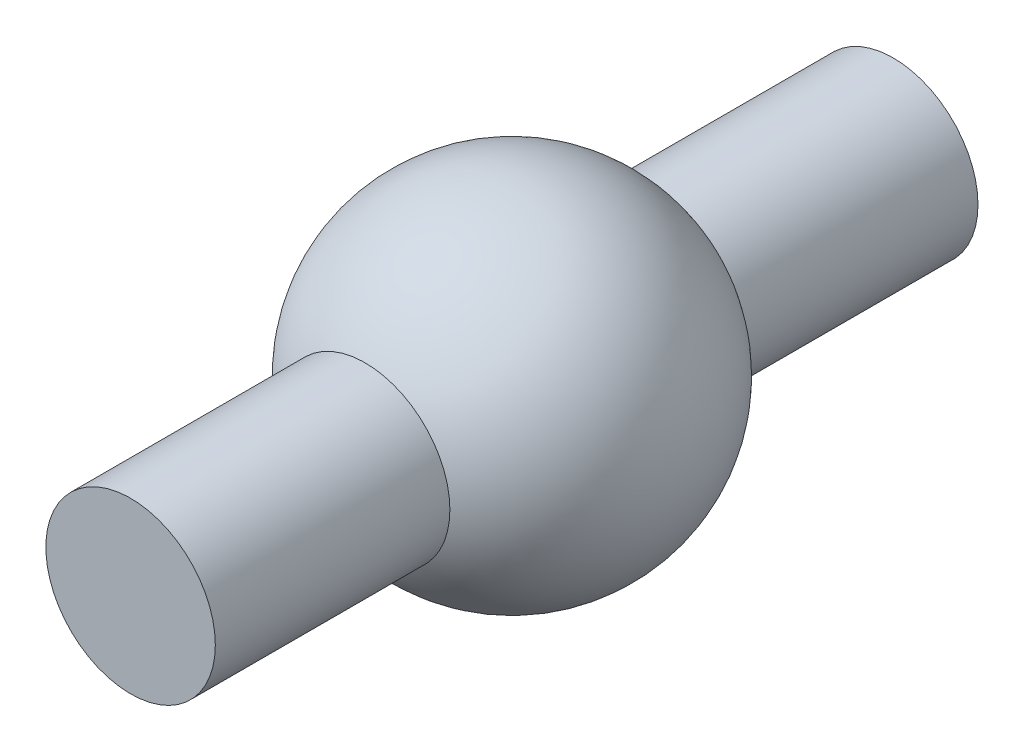
ISO-10303-21;
HEADER;
FILE_DESCRIPTION(('STEP AP214'),'2;1');
FILE_NAME('part.step','',(''),(''),'','','');
FILE_SCHEMA(('AUTOMOTIVE_DESIGN { 1 0 10303 214 1 1 1 1 }'));
ENDSEC;
DATA;
#1=APPLICATION_CONTEXT('core data for automotive mechanical design processes');
#2=APPLICATION_PROTOCOL_DEFINITION('international standard','automotive_design',2000,#1);
#3=PRODUCT_CONTEXT('',#1,'mechanical');
#4=PRODUCT('Part','Part','',(#3));
#5=PRODUCT_RELATED_PRODUCT_CATEGORY('part','',(#4));
#6=PRODUCT_DEFINITION_FORMATION('','',#4);
#7=PRODUCT_DEFINITION_CONTEXT('part definition',#1,'design');
#8=PRODUCT_DEFINITION('design','',#6,#7);
#9=PRODUCT_DEFINITION_SHAPE('','',#8);
#10=(LENGTH_UNIT() NAMED_UNIT(*) SI_UNIT(.MILLI.,.METRE.));
#11=(NAMED_UNIT(*) PLANE_ANGLE_UNIT() SI_UNIT($,.RADIAN.));
#12=(NAMED_UNIT(*) SI_UNIT($,.STERADIAN.) SOLID_ANGLE_UNIT());
#13=UNCERTAINTY_MEASURE_WITH_UNIT(LENGTH_MEASURE(1.E-05),#10,'distance_accuracy_value','');
#14=(GEOMETRIC_REPRESENTATION_CONTEXT(3) GLOBAL_UNCERTAINTY_ASSIGNED_CONTEXT((#13)) GLOBAL_UNIT_ASSIGNED_CONTEXT((#10,
#11,#12)) REPRESENTATION_CONTEXT('',''));
#15=CARTESIAN_POINT('',(0.,0.,0.));
#16=DIRECTION('',(0.,0.,1.));
#17=DIRECTION('',(1.,0.,0.));
#18=AXIS2_PLACEMENT_3D('',#15,#16,#17);
#19=CARTESIAN_POINT('',(0.,0.,5.715));
#20=DIRECTION('',(0.,0.,-1.));
#21=DIRECTION('',(-1.,0.,0.));
#22=AXIS2_PLACEMENT_3D('',#19,#20,#21);
#23=CYLINDRICAL_SURFACE('',#22,1.27);
#24=CARTESIAN_POINT('',(0.,0.,-5.715));
#25=DIRECTION('',(0.,0.,1.));
#26=DIRECTION('',(1.,0.,0.));
#27=AXIS2_PLACEMENT_3D('',#24,#25,#26);
#28=CIRCLE('',#27,1.27);
#29=CARTESIAN_POINT('',(1.27,0.,-5.715));
#30=VERTEX_POINT('',#29);
#31=EDGE_CURVE('E45',#30,#30,#28,.T.);
#32=ORIENTED_EDGE('',*,*,#31,.T.);
#33=EDGE_LOOP('',(#32));
#34=FACE_BOUND('',#33,.T.);
#35=CARTESIAN_POINT('',(0.,0.,-2.19970452561247));
#36=DIRECTION('',(0.,0.,1.));
#37=DIRECTION('',(1.,0.,0.));
#38=AXIS2_PLACEMENT_3D('',#35,#36,#37);
#39=CIRCLE('',#38,1.27);
#40=CARTESIAN_POINT('',(1.27,0.,-2.19970452561247));
#41=VERTEX_POINT('',#40);
#42=EDGE_CURVE('E10',#41,#41,#39,.F.);
#43=ORIENTED_EDGE('',*,*,#42,.T.);
#44=EDGE_LOOP('',(#43));
#45=FACE_BOUND('',#44,.T.);
#46=ADVANCED_FACE('F30',(#34,#45),#23,.T.);
#47=CARTESIAN_POINT('',(0.,0.,-5.715));
#48=DIRECTION('',(0.,0.,1.));
#49=DIRECTION('',(1.,0.,0.));
#50=AXIS2_PLACEMENT_3D('',#47,#48,#49);
#51=PLANE('',#50);
#52=ORIENTED_EDGE('',*,*,#31,.F.);
#53=EDGE_LOOP('',(#52));
#54=FACE_BOUND('',#53,.T.);
#55=ADVANCED_FACE('F52',(#54),#51,.F.);
#56=CARTESIAN_POINT('',(0.,0.,0.));
#57=DIRECTION('',(0.,0.,-1.));
#58=DIRECTION('',(1.,0.,0.));
#59=AXIS2_PLACEMENT_3D('',#56,#57,#58);
#60=SPHERICAL_SURFACE('',#59,2.54);
#61=CARTESIAN_POINT('',(0.,0.,2.19970452561247));
#62=DIRECTION('',(0.,0.,-1.));
#63=DIRECTION('',(-1.,0.,0.));
#64=AXIS2_PLACEMENT_3D('',#61,#62,#63);
#65=CIRCLE('',#64,1.27);
#66=CARTESIAN_POINT('',(1.27,0.,2.19970452561247));
#67=VERTEX_POINT('',#66);
#68=EDGE_CURVE('E37',#67,#67,#65,.F.);
#69=CARTESIAN_POINT('',(1.27,0.,2.19970452561247));
#70=CARTESIAN_POINT('',(1.31799165314091,0.,2.17199974608803));
#71=CARTESIAN_POINT('',(1.36507358534347,0.,2.14271991571364));
#72=CARTESIAN_POINT('',(1.45722319839611,0.,2.08114571478329));
#73=CARTESIAN_POINT('',(1.50229087924619,0.,2.04885134422733));
#74=CARTESIAN_POINT('',(1.59021718011811,0.,1.98138362445215));
#75=CARTESIAN_POINT('',(1.63307580013995,0.,1.94621027523292));
#76=CARTESIAN_POINT('',(1.7164009405684,0.,1.87313594676028));
#77=CARTESIAN_POINT('',(1.756867460975,0.,1.83523496750687));
#78=CARTESIAN_POINT('',(1.83523498745266,0.,1.7568674809208));
#79=CARTESIAN_POINT('',(1.87313599352373,0.,1.71640097358814));
#80=CARTESIAN_POINT('',(1.94621022846947,0.,1.63307576712021));
#81=CARTESIAN_POINT('',(1.98138345734415,0.,1.59021706798494));
#82=CARTESIAN_POINT('',(2.04885151133532,0.,1.50229099137936));
#83=CARTESIAN_POINT('',(2.08114633645182,0.,1.45722361390907));
#84=CARTESIAN_POINT('',(2.14271929404511,0.,1.36507316983051));
#85=CARTESIAN_POINT('',(2.1719974265219,0.,1.31799010322226));
#86=CARTESIAN_POINT('',(2.22741162470305,0.,1.22200989677774));
#87=CARTESIAN_POINT('',(2.25354769040741,0.,1.17311275694147));
#88=CARTESIAN_POINT('',(2.30256583657864,0.,1.07371378937105));
#89=CARTESIAN_POINT('',(2.32544791704551,0.,1.0232119616369));
#90=CARTESIAN_POINT('',(2.36786010811183,0.,0.920819874777757));
#91=CARTESIAN_POINT('',(2.38739021871128,0.,0.868929615652769));
#92=CARTESIAN_POINT('',(2.42301483912385,0.,0.763982868087292));
#93=CARTESIAN_POINT('',(2.43910934893697,0.,0.710926379646803));
#94=CARTESIAN_POINT('',(2.4677938486115,0.,0.603874369474003));
#95=CARTESIAN_POINT('',(2.4803838384729,0.,0.549878847741691));
#96=CARTESIAN_POINT('',(2.50200538597551,0.,0.441179988100241));
#97=CARTESIAN_POINT('',(2.5110369436167,0.,0.386476650191102));
#98=CARTESIAN_POINT('',(2.52550295216226,0.,0.27659640628676));
#99=CARTESIAN_POINT('',(2.53093740306662,0.,0.221419500291557));
#100=CARTESIAN_POINT('',(2.53818592698549,0.,0.11082839619757));
#101=CARTESIAN_POINT('',(2.54,0.,0.0554141980987848));
#102=CARTESIAN_POINT('',(2.54,0.,-0.0554141980987847));
#103=CARTESIAN_POINT('',(2.53818592698549,0.,-0.110828396197569));
#104=CARTESIAN_POINT('',(2.53093740306662,0.,-0.221419500291557));
#105=CARTESIAN_POINT('',(2.52550295216226,0.,-0.27659640628676));
#106=CARTESIAN_POINT('',(2.5110369436167,0.,-0.386476650191102));
#107=CARTESIAN_POINT('',(2.50200538597551,0.,-0.441179988100241));
#108=CARTESIAN_POINT('',(2.4803838384729,0.,-0.549878847741691));
#109=CARTESIAN_POINT('',(2.4677938486115,0.,-0.603874369474003));
#110=CARTESIAN_POINT('',(2.43910934893697,0.,-0.710926379646803));
#111=CARTESIAN_POINT('',(2.42301483912385,0.,-0.763982868087292));
#112=CARTESIAN_POINT('',(2.38739021871128,0.,-0.868929615652769));
#113=CARTESIAN_POINT('',(2.36786010811183,0.,-0.920819874777757));
#114=CARTESIAN_POINT('',(2.32544791704551,0.,-1.0232119616369));
#115=CARTESIAN_POINT('',(2.30256583657864,0.,-1.07371378937105));
#116=CARTESIAN_POINT('',(2.25354769040741,0.,-1.17311275694147));
#117=CARTESIAN_POINT('',(2.22741162470305,0.,-1.22200989677774));
#118=CARTESIAN_POINT('',(2.1719974265219,0.,-1.31799010322226));
#119=CARTESIAN_POINT('',(2.14271929404511,0.,-1.36507316983051));
#120=CARTESIAN_POINT('',(2.08114633645182,0.,-1.45722361390907));
#121=CARTESIAN_POINT('',(2.04885151133532,0.,-1.50229099137936));
#122=CARTESIAN_POINT('',(1.98138345734415,0.,-1.59021706798494));
#123=CARTESIAN_POINT('',(1.94621022846947,0.,-1.63307576712021));
#124=CARTESIAN_POINT('',(1.87313599352373,0.,-1.71640097358814));
#125=CARTESIAN_POINT('',(1.83523498745266,0.,-1.75686748092079));
#126=CARTESIAN_POINT('',(1.756867460975,0.,-1.83523496750687));
#127=CARTESIAN_POINT('',(1.7164009405684,0.,-1.87313594676028));
#128=CARTESIAN_POINT('',(1.63307580013995,0.,-1.94621027523292));
#129=CARTESIAN_POINT('',(1.59021718011811,0.,-1.98138362445215));
#130=CARTESIAN_POINT('',(1.50229087924619,0.,-2.04885134422733));
#131=CARTESIAN_POINT('',(1.45722319839611,0.,-2.08114571478329));
#132=CARTESIAN_POINT('',(1.36507358534347,0.,-2.14271991571364));
#133=CARTESIAN_POINT('',(1.31799165314091,0.,-2.17199974608803));
#134=CARTESIAN_POINT('',(1.27,0.,-2.19970452561247));
#135=B_SPLINE_CURVE_WITH_KNOTS('',3,(#69,#70,#71,#72,#73,#74,#75,#76,#77,#78,#79,#80,#81,#82,
#83,#84,#85,#86,#87,#88,#89,#90,#91,#92,#93,#94,#95,#96,#97,#98,#99,#100,#101,#102,#103,#104,
#105,#106,#107,#108,#109,#110,#111,#112,#113,#114,#115,#116,#117,#118,#119,#120,#121,#122,#123,
#124,#125,#126,#127,#128,#129,#130,#131,#132,#133,#134),.UNSPECIFIED.,.F.,.F.,(4,2,2,2,2,2,2,2,
2,2,2,2,2,2,2,2,2,2,2,2,2,2,2,2,2,2,2,2,2,2,2,2,4),(0.,0.166212940734623,0.332425881469246,
0.498638822203868,0.664851762938491,0.831064703673114,0.997277644407737,1.16349058514236,
1.32970352587698,1.49591646661161,1.66212940734623,1.82834234808085,1.99455528881547,
2.1607682295501,2.32698117028472,2.49319411101934,2.65940705175396,2.82561999248859,
2.99183293322321,3.15804587395783,3.32425881469246,3.49047175542708,3.6566846961617,
3.82289763689633,3.98911057763095,4.15532351836557,4.3215364591002,4.48774939983482,
4.65396234056944,4.82017528130406,4.98638822203869,5.15260116277331,5.31881410350793),.UNSPECIFIED.);
#136=EDGE_CURVE('BSEAM32',#67,#41,#135,.T.);
#137=ORIENTED_EDGE('',*,*,#68,.F.);
#138=ORIENTED_EDGE('',*,*,#42,.F.);
#139=ORIENTED_EDGE('',*,*,#136,.T.);
#140=ORIENTED_EDGE('',*,*,#136,.F.);
#141=EDGE_LOOP('',(#137,#139,#138,#140));
#142=FACE_BOUND('',#141,.T.);
#143=ADVANCED_FACE('F32',(#142),#60,.T.);
#144=CARTESIAN_POINT('',(0.,0.,5.715));
#145=DIRECTION('',(0.,0.,1.));
#146=DIRECTION('',(1.,0.,0.));
#147=AXIS2_PLACEMENT_3D('',#144,#145,#146);
#148=PLANE('',#147);
#149=CARTESIAN_POINT('',(0.,0.,5.715));
#150=DIRECTION('',(0.,0.,1.));
#151=DIRECTION('',(1.,0.,0.));
#152=AXIS2_PLACEMENT_3D('',#149,#150,#151);
#153=CIRCLE('',#152,1.27);
#154=CARTESIAN_POINT('',(1.27,0.,5.715));
#155=VERTEX_POINT('',#154);
#156=EDGE_CURVE('E41',#155,#155,#153,.T.);
#157=ORIENTED_EDGE('',*,*,#156,.T.);
#158=EDGE_LOOP('',(#157));
#159=FACE_BOUND('',#158,.T.);
#160=ADVANCED_FACE('F59',(#159),#148,.T.);
#161=ORIENTED_EDGE('',*,*,#156,.F.);
#162=EDGE_LOOP('',(#161));
#163=FACE_BOUND('',#162,.T.);
#164=ORIENTED_EDGE('',*,*,#68,.T.);
#165=EDGE_LOOP('',(#164));
#166=FACE_BOUND('',#165,.T.);
#167=ADVANCED_FACE('F61',(#163,#166),#23,.T.);
#168=CLOSED_SHELL('',(#46,#55,#143,#160,#167));
#169=MANIFOLD_SOLID_BREP('B2',#168);
#170=ADVANCED_BREP_SHAPE_REPRESENTATION('',(#18,#169),#14);
#171=SHAPE_DEFINITION_REPRESENTATION(#9,#170);
ENDSEC;
END-ISO-10303-21;
